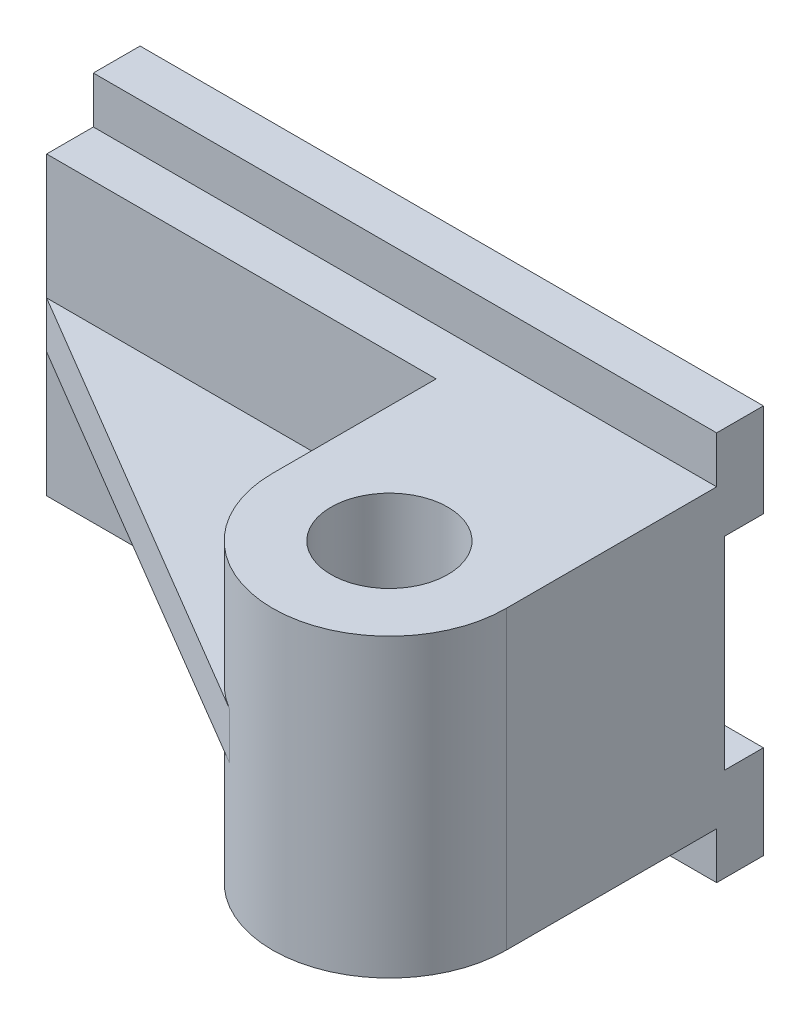
ISO-10303-21;
HEADER;
FILE_DESCRIPTION(('STEP AP214'),'2;1');
FILE_NAME('part.step','',(''),(''),'','','');
FILE_SCHEMA(('AUTOMOTIVE_DESIGN { 1 0 10303 214 1 1 1 1 }'));
ENDSEC;
DATA;
#1=APPLICATION_CONTEXT('core data for automotive mechanical design processes');
#2=APPLICATION_PROTOCOL_DEFINITION('international standard','automotive_design',2000,#1);
#3=PRODUCT_CONTEXT('',#1,'mechanical');
#4=PRODUCT('Part','Part','',(#3));
#5=PRODUCT_RELATED_PRODUCT_CATEGORY('part','',(#4));
#6=PRODUCT_DEFINITION_FORMATION('','',#4);
#7=PRODUCT_DEFINITION_CONTEXT('part definition',#1,'design');
#8=PRODUCT_DEFINITION('design','',#6,#7);
#9=PRODUCT_DEFINITION_SHAPE('','',#8);
#10=(LENGTH_UNIT() NAMED_UNIT(*) SI_UNIT(.MILLI.,.METRE.));
#11=(NAMED_UNIT(*) PLANE_ANGLE_UNIT() SI_UNIT($,.RADIAN.));
#12=(NAMED_UNIT(*) SI_UNIT($,.STERADIAN.) SOLID_ANGLE_UNIT());
#13=UNCERTAINTY_MEASURE_WITH_UNIT(LENGTH_MEASURE(1.E-05),#10,'distance_accuracy_value','');
#14=(GEOMETRIC_REPRESENTATION_CONTEXT(3) GLOBAL_UNCERTAINTY_ASSIGNED_CONTEXT((#13)) GLOBAL_UNIT_ASSIGNED_CONTEXT((#10,
#11,#12)) REPRESENTATION_CONTEXT('',''));
#15=CARTESIAN_POINT('',(0.,0.,0.));
#16=DIRECTION('',(0.,0.,1.));
#17=DIRECTION('',(1.,0.,0.));
#18=AXIS2_PLACEMENT_3D('',#15,#16,#17);
#19=CARTESIAN_POINT('',(0.,0.,12.));
#20=DIRECTION('',(0.,0.,1.));
#21=DIRECTION('',(1.,0.,0.));
#22=AXIS2_PLACEMENT_3D('',#19,#20,#21);
#23=PLANE('',#22);
#24=DIRECTION('',(0.,-1.,0.));
#25=VECTOR('',#24,1.);
#26=CARTESIAN_POINT('',(19.9999999999999,38.,12.));
#27=LINE('',#26,#25);
#28=CARTESIAN_POINT('',(19.9999999999999,-6.,12.));
#29=VERTEX_POINT('',#28);
#30=CARTESIAN_POINT('',(19.9999999999999,-38.,12.));
#31=VERTEX_POINT('',#30);
#32=EDGE_CURVE('E189',#29,#31,#27,.T.);
#33=ORIENTED_EDGE('',*,*,#32,.F.);
#34=DIRECTION('',(-1.,0.,0.));
#35=VECTOR('',#34,1.);
#36=CARTESIAN_POINT('',(0.,-6.,12.));
#37=LINE('',#36,#35);
#38=CARTESIAN_POINT('',(-80.0000000000001,-6.,12.));
#39=VERTEX_POINT('',#38);
#40=EDGE_CURVE('E181',#29,#39,#37,.T.);
#41=ORIENTED_EDGE('',*,*,#40,.T.);
#42=DIRECTION('',(0.,-1.,0.));
#43=VECTOR('',#42,1.);
#44=CARTESIAN_POINT('',(-80.0000000000001,38.,12.));
#45=LINE('',#44,#43);
#46=CARTESIAN_POINT('',(-80.0000000000001,-38.,12.));
#47=VERTEX_POINT('',#46);
#48=EDGE_CURVE('E187',#39,#47,#45,.T.);
#49=ORIENTED_EDGE('',*,*,#48,.T.);
#50=DIRECTION('',(1.,0.,0.));
#51=VECTOR('',#50,1.);
#52=CARTESIAN_POINT('',(-80.0000000000001,-38.,12.));
#53=LINE('',#52,#51);
#54=EDGE_CURVE('E201',#47,#31,#53,.T.);
#55=ORIENTED_EDGE('',*,*,#54,.T.);
#56=EDGE_LOOP('',(#33,#41,#49,#55));
#57=FACE_BOUND('',#56,.T.);
#58=ADVANCED_FACE('F39',(#57),#23,.T.);
#59=CARTESIAN_POINT('',(19.9999999999999,38.,0.));
#60=DIRECTION('',(1.,0.,0.));
#61=DIRECTION('',(0.,0.,-1.));
#62=AXIS2_PLACEMENT_3D('',#59,#60,#61);
#63=PLANE('',#62);
#64=DIRECTION('',(0.,0.,1.));
#65=VECTOR('',#64,1.);
#66=CARTESIAN_POINT('',(19.9999999999999,-6.,0.));
#67=LINE('',#66,#65);
#68=CARTESIAN_POINT('',(19.9999999999999,-6.,54.));
#69=VERTEX_POINT('',#68);
#70=EDGE_CURVE('E54',#29,#69,#67,.T.);
#71=ORIENTED_EDGE('',*,*,#70,.F.);
#72=ORIENTED_EDGE('',*,*,#32,.T.);
#73=DIRECTION('',(0.,0.,1.));
#74=VECTOR('',#73,1.);
#75=CARTESIAN_POINT('',(19.9999999999999,-38.,0.));
#76=LINE('',#75,#74);
#77=CARTESIAN_POINT('',(19.9999999999999,-38.,54.));
#78=VERTEX_POINT('',#77);
#79=EDGE_CURVE('E276',#31,#78,#76,.T.);
#80=ORIENTED_EDGE('',*,*,#79,.T.);
#81=DIRECTION('',(0.,-1.,0.));
#82=VECTOR('',#81,1.);
#83=CARTESIAN_POINT('',(19.9999999999999,38.,54.));
#84=LINE('',#83,#82);
#85=EDGE_CURVE('E293',#69,#78,#84,.T.);
#86=ORIENTED_EDGE('',*,*,#85,.F.);
#87=EDGE_LOOP('',(#71,#72,#80,#86));
#88=FACE_BOUND('',#87,.T.);
#89=ADVANCED_FACE('F369',(#88),#63,.F.);
#90=CARTESIAN_POINT('',(0.,0.,-12.));
#91=DIRECTION('',(0.,0.,-1.));
#92=DIRECTION('',(-1.,0.,0.));
#93=AXIS2_PLACEMENT_3D('',#90,#91,#92);
#94=PLANE('',#93);
#95=DIRECTION('',(0.,-1.,0.));
#96=VECTOR('',#95,1.);
#97=CARTESIAN_POINT('',(-80.0000000000001,-50.,-12.));
#98=LINE('',#97,#96);
#99=CARTESIAN_POINT('',(-80.0000000000001,-26.,-12.));
#100=VERTEX_POINT('',#99);
#101=CARTESIAN_POINT('',(-80.0000000000001,-50.,-12.));
#102=VERTEX_POINT('',#101);
#103=EDGE_CURVE('E232',#100,#102,#98,.T.);
#104=ORIENTED_EDGE('',*,*,#103,.F.);
#105=DIRECTION('',(1.,0.,0.));
#106=VECTOR('',#105,1.);
#107=CARTESIAN_POINT('',(-517.749868559375,-26.,-12.));
#108=LINE('',#107,#106);
#109=CARTESIAN_POINT('',(79.9999999999999,-26.,-12.));
#110=VERTEX_POINT('',#109);
#111=EDGE_CURVE('E295',#100,#110,#108,.T.);
#112=ORIENTED_EDGE('',*,*,#111,.T.);
#113=DIRECTION('',(0.,1.,0.));
#114=VECTOR('',#113,1.);
#115=CARTESIAN_POINT('',(79.9999999999999,-50.,-12.));
#116=LINE('',#115,#114);
#117=CARTESIAN_POINT('',(79.9999999999999,-50.,-12.));
#118=VERTEX_POINT('',#117);
#119=EDGE_CURVE('E225',#118,#110,#116,.T.);
#120=ORIENTED_EDGE('',*,*,#119,.F.);
#121=DIRECTION('',(1.,0.,0.));
#122=VECTOR('',#121,1.);
#123=CARTESIAN_POINT('',(-80.0000000000001,-50.,-12.));
#124=LINE('',#123,#122);
#125=EDGE_CURVE('E236',#102,#118,#124,.T.);
#126=ORIENTED_EDGE('',*,*,#125,.F.);
#127=EDGE_LOOP('',(#104,#112,#120,#126));
#128=FACE_BOUND('',#127,.T.);
#129=ADVANCED_FACE('F355',(#128),#94,.T.);
#130=CARTESIAN_POINT('',(0.,0.,0.));
#131=DIRECTION('',(0.,0.,-1.));
#132=DIRECTION('',(-1.,0.,0.));
#133=AXIS2_PLACEMENT_3D('',#130,#131,#132);
#134=PLANE('',#133);
#135=DIRECTION('',(-1.,0.,0.));
#136=VECTOR('',#135,1.);
#137=CARTESIAN_POINT('',(-80.0000000000001,38.,0.));
#138=LINE('',#137,#136);
#139=CARTESIAN_POINT('',(79.9999999999999,38.,0.));
#140=VERTEX_POINT('',#139);
#141=CARTESIAN_POINT('',(-80.0000000000001,38.,0.));
#142=VERTEX_POINT('',#141);
#143=EDGE_CURVE('E199',#140,#142,#138,.T.);
#144=ORIENTED_EDGE('',*,*,#143,.F.);
#145=DIRECTION('',(0.,1.,0.));
#146=VECTOR('',#145,1.);
#147=CARTESIAN_POINT('',(79.9999999999999,-50.,0.));
#148=LINE('',#147,#146);
#149=CARTESIAN_POINT('',(79.9999999999999,50.,0.));
#150=VERTEX_POINT('',#149);
#151=EDGE_CURVE('E224',#140,#150,#148,.T.);
#152=ORIENTED_EDGE('',*,*,#151,.T.);
#153=DIRECTION('',(-1.,0.,0.));
#154=VECTOR('',#153,1.);
#155=CARTESIAN_POINT('',(-80.0000000000001,50.,0.));
#156=LINE('',#155,#154);
#157=CARTESIAN_POINT('',(-80.0000000000001,50.,0.));
#158=VERTEX_POINT('',#157);
#159=EDGE_CURVE('E242',#150,#158,#156,.T.);
#160=ORIENTED_EDGE('',*,*,#159,.T.);
#161=DIRECTION('',(0.,-1.,0.));
#162=VECTOR('',#161,1.);
#163=CARTESIAN_POINT('',(-80.0000000000001,-50.,0.));
#164=LINE('',#163,#162);
#165=EDGE_CURVE('E246',#158,#142,#164,.T.);
#166=ORIENTED_EDGE('',*,*,#165,.T.);
#167=EDGE_LOOP('',(#144,#152,#160,#166));
#168=FACE_BOUND('',#167,.T.);
#169=ADVANCED_FACE('F476',(#168),#134,.F.);
#170=DIRECTION('',(1.,0.,0.));
#171=VECTOR('',#170,1.);
#172=CARTESIAN_POINT('',(-80.0000000000001,-38.,0.));
#173=LINE('',#172,#171);
#174=CARTESIAN_POINT('',(-80.0000000000001,-38.,0.));
#175=VERTEX_POINT('',#174);
#176=CARTESIAN_POINT('',(79.9999999999999,-38.,0.));
#177=VERTEX_POINT('',#176);
#178=EDGE_CURVE('E203',#175,#177,#173,.T.);
#179=ORIENTED_EDGE('',*,*,#178,.F.);
#180=CARTESIAN_POINT('',(-80.0000000000001,-50.,0.));
#181=VERTEX_POINT('',#180);
#182=EDGE_CURVE('E245',#175,#181,#164,.T.);
#183=ORIENTED_EDGE('',*,*,#182,.T.);
#184=DIRECTION('',(1.,0.,0.));
#185=VECTOR('',#184,1.);
#186=CARTESIAN_POINT('',(-80.0000000000001,-50.,0.));
#187=LINE('',#186,#185);
#188=CARTESIAN_POINT('',(79.9999999999999,-50.,0.));
#189=VERTEX_POINT('',#188);
#190=EDGE_CURVE('E248',#181,#189,#187,.T.);
#191=ORIENTED_EDGE('',*,*,#190,.T.);
#192=EDGE_CURVE('E240',#189,#177,#148,.T.);
#193=ORIENTED_EDGE('',*,*,#192,.T.);
#194=EDGE_LOOP('',(#179,#183,#191,#193));
#195=FACE_BOUND('',#194,.T.);
#196=ADVANCED_FACE('F346',(#195),#134,.F.);
#197=CARTESIAN_POINT('',(79.9999999999999,-50.,-12.));
#198=DIRECTION('',(1.,0.,0.));
#199=DIRECTION('',(0.,0.,-1.));
#200=AXIS2_PLACEMENT_3D('',#197,#198,#199);
#201=PLANE('',#200);
#202=DIRECTION('',(0.,-1.,0.));
#203=VECTOR('',#202,1.);
#204=CARTESIAN_POINT('',(79.9999999999999,38.,54.));
#205=LINE('',#204,#203);
#206=CARTESIAN_POINT('',(79.9999999999999,38.,54.));
#207=VERTEX_POINT('',#206);
#208=CARTESIAN_POINT('',(79.9999999999999,-38.,54.));
#209=VERTEX_POINT('',#208);
#210=EDGE_CURVE('E284',#207,#209,#205,.T.);
#211=ORIENTED_EDGE('',*,*,#210,.T.);
#212=DIRECTION('',(0.,0.,-1.));
#213=VECTOR('',#212,1.);
#214=CARTESIAN_POINT('',(79.9999999999999,-38.,12.));
#215=LINE('',#214,#213);
#216=EDGE_CURVE('E220',#209,#177,#215,.T.);
#217=ORIENTED_EDGE('',*,*,#216,.T.);
#218=ORIENTED_EDGE('',*,*,#192,.F.);
#219=DIRECTION('',(0.,0.,1.));
#220=VECTOR('',#219,1.);
#221=CARTESIAN_POINT('',(79.9999999999999,-50.,-12.));
#222=LINE('',#221,#220);
#223=EDGE_CURVE('E251',#118,#189,#222,.T.);
#224=ORIENTED_EDGE('',*,*,#223,.F.);
#225=ORIENTED_EDGE('',*,*,#119,.T.);
#226=DIRECTION('',(0.,0.,-1.));
#227=VECTOR('',#226,1.);
#228=CARTESIAN_POINT('',(79.9999999999999,-26.,-12.));
#229=LINE('',#228,#227);
#230=CARTESIAN_POINT('',(79.9999999999999,-26.,-2.));
#231=VERTEX_POINT('',#230);
#232=EDGE_CURVE('E305',#231,#110,#229,.T.);
#233=ORIENTED_EDGE('',*,*,#232,.F.);
#234=DIRECTION('',(0.,-1.,0.));
#235=VECTOR('',#234,1.);
#236=CARTESIAN_POINT('',(79.9999999999999,-50.,-2.));
#237=LINE('',#236,#235);
#238=CARTESIAN_POINT('',(79.9999999999999,26.,-2.00000000000001));
#239=VERTEX_POINT('',#238);
#240=EDGE_CURVE('E307',#239,#231,#237,.T.);
#241=ORIENTED_EDGE('',*,*,#240,.F.);
#242=DIRECTION('',(0.,0.,1.));
#243=VECTOR('',#242,1.);
#244=CARTESIAN_POINT('',(79.9999999999999,26.,-12.));
#245=LINE('',#244,#243);
#246=CARTESIAN_POINT('',(79.9999999999999,26.,-12.));
#247=VERTEX_POINT('',#246);
#248=EDGE_CURVE('E207',#247,#239,#245,.T.);
#249=ORIENTED_EDGE('',*,*,#248,.F.);
#250=CARTESIAN_POINT('',(79.9999999999999,50.,-12.));
#251=VERTEX_POINT('',#250);
#252=EDGE_CURVE('E229',#247,#251,#116,.T.);
#253=ORIENTED_EDGE('',*,*,#252,.T.);
#254=DIRECTION('',(0.,0.,1.));
#255=VECTOR('',#254,1.);
#256=CARTESIAN_POINT('',(79.9999999999999,50.,-12.));
#257=LINE('',#256,#255);
#258=EDGE_CURVE('E239',#251,#150,#257,.T.);
#259=ORIENTED_EDGE('',*,*,#258,.T.);
#260=ORIENTED_EDGE('',*,*,#151,.F.);
#261=DIRECTION('',(0.,0.,-1.));
#262=VECTOR('',#261,1.);
#263=CARTESIAN_POINT('',(79.9999999999999,38.,12.));
#264=LINE('',#263,#262);
#265=EDGE_CURVE('E217',#207,#140,#264,.T.);
#266=ORIENTED_EDGE('',*,*,#265,.F.);
#267=EDGE_LOOP('',(#211,#217,#218,#224,#225,#233,#241,#249,#253,#259,#260,#266));
#268=FACE_BOUND('',#267,.T.);
#269=ADVANCED_FACE('F41',(#268),#201,.T.);
#270=CARTESIAN_POINT('',(-80.0000000000001,-50.,-12.));
#271=DIRECTION('',(0.,-1.,0.));
#272=DIRECTION('',(0.,0.,-1.));
#273=AXIS2_PLACEMENT_3D('',#270,#271,#272);
#274=PLANE('',#273);
#275=ORIENTED_EDGE('',*,*,#190,.F.);
#276=DIRECTION('',(0.,0.,1.));
#277=VECTOR('',#276,1.);
#278=CARTESIAN_POINT('',(-80.0000000000001,-50.,-12.));
#279=LINE('',#278,#277);
#280=EDGE_CURVE('E254',#102,#181,#279,.T.);
#281=ORIENTED_EDGE('',*,*,#280,.F.);
#282=ORIENTED_EDGE('',*,*,#125,.T.);
#283=ORIENTED_EDGE('',*,*,#223,.T.);
#284=EDGE_LOOP('',(#275,#281,#282,#283));
#285=FACE_BOUND('',#284,.T.);
#286=ADVANCED_FACE('F352',(#285),#274,.T.);
#287=CARTESIAN_POINT('',(-80.0000000000001,-50.,-12.));
#288=DIRECTION('',(-1.,0.,0.));
#289=DIRECTION('',(0.,0.,1.));
#290=AXIS2_PLACEMENT_3D('',#287,#288,#289);
#291=PLANE('',#290);
#292=DIRECTION('',(0.,0.,-1.));
#293=VECTOR('',#292,1.);
#294=CARTESIAN_POINT('',(-80.0000000000001,26.,-12.));
#295=LINE('',#294,#293);
#296=CARTESIAN_POINT('',(-80.0000000000001,26.,-2.00000000000001));
#297=VERTEX_POINT('',#296);
#298=CARTESIAN_POINT('',(-80.0000000000001,26.,-12.));
#299=VERTEX_POINT('',#298);
#300=EDGE_CURVE('E47',#297,#299,#295,.T.);
#301=ORIENTED_EDGE('',*,*,#300,.F.);
#302=DIRECTION('',(0.,1.,0.));
#303=VECTOR('',#302,1.);
#304=CARTESIAN_POINT('',(-80.0000000000001,-50.,-2.));
#305=LINE('',#304,#303);
#306=CARTESIAN_POINT('',(-80.0000000000001,-26.,-2.));
#307=VERTEX_POINT('',#306);
#308=EDGE_CURVE('E263',#307,#297,#305,.T.);
#309=ORIENTED_EDGE('',*,*,#308,.F.);
#310=DIRECTION('',(0.,0.,1.));
#311=VECTOR('',#310,1.);
#312=CARTESIAN_POINT('',(-80.0000000000001,-26.,-12.));
#313=LINE('',#312,#311);
#314=EDGE_CURVE('E253',#100,#307,#313,.T.);
#315=ORIENTED_EDGE('',*,*,#314,.F.);
#316=ORIENTED_EDGE('',*,*,#103,.T.);
#317=ORIENTED_EDGE('',*,*,#280,.T.);
#318=ORIENTED_EDGE('',*,*,#182,.F.);
#319=DIRECTION('',(0.,0.,-1.));
#320=VECTOR('',#319,1.);
#321=CARTESIAN_POINT('',(-80.0000000000001,-38.,12.));
#322=LINE('',#321,#320);
#323=EDGE_CURVE('E197',#47,#175,#322,.T.);
#324=ORIENTED_EDGE('',*,*,#323,.F.);
#325=ORIENTED_EDGE('',*,*,#48,.F.);
#326=DIRECTION('',(0.,-1.,0.));
#327=VECTOR('',#326,1.);
#328=CARTESIAN_POINT('',(-80.0000000000001,0.,12.));
#329=LINE('',#328,#327);
#330=CARTESIAN_POINT('',(-80.0000000000001,6.,12.));
#331=VERTEX_POINT('',#330);
#332=EDGE_CURVE('E165',#331,#39,#329,.T.);
#333=ORIENTED_EDGE('',*,*,#332,.F.);
#334=CARTESIAN_POINT('',(-80.0000000000001,38.,12.));
#335=VERTEX_POINT('',#334);
#336=EDGE_CURVE('E198',#335,#331,#45,.T.);
#337=ORIENTED_EDGE('',*,*,#336,.F.);
#338=DIRECTION('',(0.,0.,-1.));
#339=VECTOR('',#338,1.);
#340=CARTESIAN_POINT('',(-80.0000000000001,38.,12.));
#341=LINE('',#340,#339);
#342=EDGE_CURVE('E212',#335,#142,#341,.T.);
#343=ORIENTED_EDGE('',*,*,#342,.T.);
#344=ORIENTED_EDGE('',*,*,#165,.F.);
#345=DIRECTION('',(0.,0.,1.));
#346=VECTOR('',#345,1.);
#347=CARTESIAN_POINT('',(-80.0000000000001,50.,-12.));
#348=LINE('',#347,#346);
#349=CARTESIAN_POINT('',(-80.0000000000001,50.,-12.));
#350=VERTEX_POINT('',#349);
#351=EDGE_CURVE('E257',#350,#158,#348,.T.);
#352=ORIENTED_EDGE('',*,*,#351,.F.);
#353=EDGE_CURVE('E233',#350,#299,#98,.T.);
#354=ORIENTED_EDGE('',*,*,#353,.T.);
#355=EDGE_LOOP('',(#301,#309,#315,#316,#317,#318,#324,#325,#333,#337,#343,#344,#352,#354));
#356=FACE_BOUND('',#355,.T.);
#357=ADVANCED_FACE('F194',(#356),#291,.T.);
#358=CARTESIAN_POINT('',(-80.0000000000001,50.,-12.));
#359=DIRECTION('',(0.,1.,0.));
#360=DIRECTION('',(0.,0.,1.));
#361=AXIS2_PLACEMENT_3D('',#358,#359,#360);
#362=PLANE('',#361);
#363=ORIENTED_EDGE('',*,*,#159,.F.);
#364=ORIENTED_EDGE('',*,*,#258,.F.);
#365=DIRECTION('',(-1.,0.,0.));
#366=VECTOR('',#365,1.);
#367=CARTESIAN_POINT('',(-80.0000000000001,50.,-12.));
#368=LINE('',#367,#366);
#369=EDGE_CURVE('E228',#251,#350,#368,.T.);
#370=ORIENTED_EDGE('',*,*,#369,.T.);
#371=ORIENTED_EDGE('',*,*,#351,.T.);
#372=EDGE_LOOP('',(#363,#364,#370,#371));
#373=FACE_BOUND('',#372,.T.);
#374=ADVANCED_FACE('F326',(#373),#362,.T.);
#375=DIRECTION('',(1.,0.,0.));
#376=VECTOR('',#375,1.);
#377=CARTESIAN_POINT('',(-517.749868559375,26.,-12.));
#378=LINE('',#377,#376);
#379=EDGE_CURVE('E302',#299,#247,#378,.T.);
#380=ORIENTED_EDGE('',*,*,#379,.F.);
#381=ORIENTED_EDGE('',*,*,#353,.F.);
#382=ORIENTED_EDGE('',*,*,#369,.F.);
#383=ORIENTED_EDGE('',*,*,#252,.F.);
#384=EDGE_LOOP('',(#380,#381,#382,#383));
#385=FACE_BOUND('',#384,.T.);
#386=ADVANCED_FACE('F322',(#385),#94,.T.);
#387=CARTESIAN_POINT('',(-80.0000000000001,-38.,12.));
#388=DIRECTION('',(0.,1.,0.));
#389=DIRECTION('',(0.,0.,1.));
#390=AXIS2_PLACEMENT_3D('',#387,#388,#389);
#391=PLANE('',#390);
#392=CARTESIAN_POINT('',(50.,-38.,54.));
#393=DIRECTION('',(0.,1.,0.));
#394=DIRECTION('',(0.,0.,1.));
#395=AXIS2_PLACEMENT_3D('',#392,#393,#394);
#396=CIRCLE('',#395,15.);
#397=CARTESIAN_POINT('',(50.,-38.,69.));
#398=VERTEX_POINT('',#397);
#399=EDGE_CURVE('E267',#398,#398,#396,.T.);
#400=ORIENTED_EDGE('',*,*,#399,.T.);
#401=EDGE_LOOP('',(#400));
#402=FACE_BOUND('',#401,.T.);
#403=ORIENTED_EDGE('',*,*,#178,.T.);
#404=ORIENTED_EDGE('',*,*,#216,.F.);
#405=CARTESIAN_POINT('',(50.,-38.,54.));
#406=DIRECTION('',(0.,-1.,0.));
#407=DIRECTION('',(0.,0.,-1.));
#408=AXIS2_PLACEMENT_3D('',#405,#406,#407);
#409=CIRCLE('',#408,30.);
#410=EDGE_CURVE('E271',#209,#78,#409,.T.);
#411=ORIENTED_EDGE('',*,*,#410,.T.);
#412=ORIENTED_EDGE('',*,*,#79,.F.);
#413=ORIENTED_EDGE('',*,*,#54,.F.);
#414=ORIENTED_EDGE('',*,*,#323,.T.);
#415=EDGE_LOOP('',(#403,#404,#411,#412,#413,#414));
#416=FACE_BOUND('',#415,.T.);
#417=ADVANCED_FACE('F343',(#402,#416),#391,.F.);
#418=CARTESIAN_POINT('',(-80.0000000000001,38.,12.));
#419=DIRECTION('',(0.,-1.,0.));
#420=DIRECTION('',(0.,0.,-1.));
#421=AXIS2_PLACEMENT_3D('',#418,#419,#420);
#422=PLANE('',#421);
#423=CARTESIAN_POINT('',(50.,38.,54.));
#424=DIRECTION('',(0.,-1.,0.));
#425=DIRECTION('',(0.,0.,-1.));
#426=AXIS2_PLACEMENT_3D('',#423,#424,#425);
#427=CIRCLE('',#426,15.);
#428=CARTESIAN_POINT('',(50.,38.,39.));
#429=VERTEX_POINT('',#428);
#430=EDGE_CURVE('E176',#429,#429,#427,.T.);
#431=ORIENTED_EDGE('',*,*,#430,.T.);
#432=EDGE_LOOP('',(#431));
#433=FACE_BOUND('',#432,.T.);
#434=ORIENTED_EDGE('',*,*,#143,.T.);
#435=ORIENTED_EDGE('',*,*,#342,.F.);
#436=DIRECTION('',(-1.,0.,0.));
#437=VECTOR('',#436,1.);
#438=CARTESIAN_POINT('',(-80.0000000000001,38.,12.));
#439=LINE('',#438,#437);
#440=CARTESIAN_POINT('',(19.9999999999999,38.,12.));
#441=VERTEX_POINT('',#440);
#442=EDGE_CURVE('E210',#441,#335,#439,.T.);
#443=ORIENTED_EDGE('',*,*,#442,.F.);
#444=DIRECTION('',(0.,0.,1.));
#445=VECTOR('',#444,1.);
#446=CARTESIAN_POINT('',(19.9999999999999,38.,0.));
#447=LINE('',#446,#445);
#448=CARTESIAN_POINT('',(19.9999999999999,38.,54.));
#449=VERTEX_POINT('',#448);
#450=EDGE_CURVE('E283',#441,#449,#447,.T.);
#451=ORIENTED_EDGE('',*,*,#450,.T.);
#452=CARTESIAN_POINT('',(50.,38.,54.));
#453=DIRECTION('',(0.,-1.,0.));
#454=DIRECTION('',(0.,0.,-1.));
#455=AXIS2_PLACEMENT_3D('',#452,#453,#454);
#456=CIRCLE('',#455,30.);
#457=EDGE_CURVE('E280',#207,#449,#456,.T.);
#458=ORIENTED_EDGE('',*,*,#457,.F.);
#459=ORIENTED_EDGE('',*,*,#265,.T.);
#460=EDGE_LOOP('',(#434,#435,#443,#451,#458,#459));
#461=FACE_BOUND('',#460,.T.);
#462=ADVANCED_FACE('F332',(#433,#461),#422,.F.);
#463=DIRECTION('',(-1.,0.,0.));
#464=VECTOR('',#463,1.);
#465=CARTESIAN_POINT('',(0.,6.,12.));
#466=LINE('',#465,#464);
#467=CARTESIAN_POINT('',(19.9999999999999,6.,12.));
#468=VERTEX_POINT('',#467);
#469=EDGE_CURVE('E177',#468,#331,#466,.T.);
#470=ORIENTED_EDGE('',*,*,#469,.F.);
#471=EDGE_CURVE('E62',#441,#468,#27,.T.);
#472=ORIENTED_EDGE('',*,*,#471,.F.);
#473=ORIENTED_EDGE('',*,*,#442,.T.);
#474=ORIENTED_EDGE('',*,*,#336,.T.);
#475=EDGE_LOOP('',(#470,#472,#473,#474));
#476=FACE_BOUND('',#475,.T.);
#477=ADVANCED_FACE('F375',(#476),#23,.T.);
#478=CARTESIAN_POINT('',(-517.749868559375,26.,-12.));
#479=DIRECTION('',(0.,1.,0.));
#480=DIRECTION('',(0.,0.,1.));
#481=AXIS2_PLACEMENT_3D('',#478,#479,#480);
#482=PLANE('',#481);
#483=ORIENTED_EDGE('',*,*,#379,.T.);
#484=ORIENTED_EDGE('',*,*,#248,.T.);
#485=DIRECTION('',(1.,0.,0.));
#486=VECTOR('',#485,1.);
#487=CARTESIAN_POINT('',(-517.749868559375,26.,-2.00000000000001));
#488=LINE('',#487,#486);
#489=EDGE_CURVE('E297',#297,#239,#488,.T.);
#490=ORIENTED_EDGE('',*,*,#489,.F.);
#491=ORIENTED_EDGE('',*,*,#300,.T.);
#492=EDGE_LOOP('',(#483,#484,#490,#491));
#493=FACE_BOUND('',#492,.T.);
#494=ADVANCED_FACE('F314',(#493),#482,.F.);
#495=CARTESIAN_POINT('',(-517.749868559375,26.,-2.00000000000001));
#496=DIRECTION('',(0.,0.,1.));
#497=DIRECTION('',(0.,-1.,0.));
#498=AXIS2_PLACEMENT_3D('',#495,#496,#497);
#499=PLANE('',#498);
#500=ORIENTED_EDGE('',*,*,#240,.T.);
#501=DIRECTION('',(1.,0.,0.));
#502=VECTOR('',#501,1.);
#503=CARTESIAN_POINT('',(-517.749868559375,-26.,-2.));
#504=LINE('',#503,#502);
#505=EDGE_CURVE('E289',#307,#231,#504,.T.);
#506=ORIENTED_EDGE('',*,*,#505,.F.);
#507=ORIENTED_EDGE('',*,*,#308,.T.);
#508=ORIENTED_EDGE('',*,*,#489,.T.);
#509=EDGE_LOOP('',(#500,#506,#507,#508));
#510=FACE_BOUND('',#509,.T.);
#511=ADVANCED_FACE('F317',(#510),#499,.F.);
#512=CARTESIAN_POINT('',(-517.749868559375,-26.,-2.));
#513=DIRECTION('',(0.,-1.,0.));
#514=DIRECTION('',(0.,0.,-1.));
#515=AXIS2_PLACEMENT_3D('',#512,#513,#514);
#516=PLANE('',#515);
#517=ORIENTED_EDGE('',*,*,#505,.T.);
#518=ORIENTED_EDGE('',*,*,#232,.T.);
#519=ORIENTED_EDGE('',*,*,#111,.F.);
#520=ORIENTED_EDGE('',*,*,#314,.T.);
#521=EDGE_LOOP('',(#517,#518,#519,#520));
#522=FACE_BOUND('',#521,.T.);
#523=ADVANCED_FACE('F358',(#522),#516,.F.);
#524=ORIENTED_EDGE('',*,*,#471,.T.);
#525=DIRECTION('',(0.,0.,1.));
#526=VECTOR('',#525,1.);
#527=CARTESIAN_POINT('',(19.9999999999999,6.,0.));
#528=LINE('',#527,#526);
#529=CARTESIAN_POINT('',(20.,6.,54.));
#530=VERTEX_POINT('',#529);
#531=EDGE_CURVE('E388',#468,#530,#528,.T.);
#532=ORIENTED_EDGE('',*,*,#531,.T.);
#533=EDGE_CURVE('E290',#449,#530,#84,.T.);
#534=ORIENTED_EDGE('',*,*,#533,.F.);
#535=ORIENTED_EDGE('',*,*,#450,.F.);
#536=EDGE_LOOP('',(#524,#532,#534,#535));
#537=FACE_BOUND('',#536,.T.);
#538=ADVANCED_FACE('F360',(#537),#63,.F.);
#539=CARTESIAN_POINT('',(50.,38.,54.));
#540=DIRECTION('',(0.,-1.,0.));
#541=DIRECTION('',(0.,0.,-1.));
#542=AXIS2_PLACEMENT_3D('',#539,#540,#541);
#543=CYLINDRICAL_SURFACE('',#542,30.);
#544=CARTESIAN_POINT('',(50.,6.,54.));
#545=DIRECTION('',(0.,1.,0.));
#546=DIRECTION('',(0.,0.,1.));
#547=AXIS2_PLACEMENT_3D('',#544,#545,#546);
#548=CIRCLE('',#547,30.);
#549=CARTESIAN_POINT('',(34.7334500974075,6.,79.8250354127861));
#550=VERTEX_POINT('',#549);
#551=EDGE_CURVE('E190',#550,#530,#548,.F.);
#552=ORIENTED_EDGE('',*,*,#551,.F.);
#553=DIRECTION('',(0.,-1.,0.));
#554=VECTOR('',#553,1.);
#555=CARTESIAN_POINT('',(34.7334500974075,38.,79.8250354127861));
#556=LINE('',#555,#554);
#557=CARTESIAN_POINT('',(34.7334500974075,-6.,79.8250354127861));
#558=VERTEX_POINT('',#557);
#559=EDGE_CURVE('E11',#558,#550,#556,.F.);
#560=ORIENTED_EDGE('',*,*,#559,.F.);
#561=CARTESIAN_POINT('',(50.,-6.,54.));
#562=DIRECTION('',(0.,1.,0.));
#563=DIRECTION('',(0.,0.,1.));
#564=AXIS2_PLACEMENT_3D('',#561,#562,#563);
#565=CIRCLE('',#564,30.);
#566=EDGE_CURVE('E182',#558,#69,#565,.F.);
#567=ORIENTED_EDGE('',*,*,#566,.T.);
#568=ORIENTED_EDGE('',*,*,#85,.T.);
#569=ORIENTED_EDGE('',*,*,#410,.F.);
#570=ORIENTED_EDGE('',*,*,#210,.F.);
#571=ORIENTED_EDGE('',*,*,#457,.T.);
#572=ORIENTED_EDGE('',*,*,#533,.T.);
#573=EDGE_LOOP('',(#552,#560,#567,#568,#569,#570,#571,#572));
#574=FACE_BOUND('',#573,.T.);
#575=ADVANCED_FACE('F338',(#574),#543,.T.);
#576=CARTESIAN_POINT('',(50.,50.,54.));
#577=DIRECTION('',(0.,-1.,0.));
#578=DIRECTION('',(0.,0.,-1.));
#579=AXIS2_PLACEMENT_3D('',#576,#577,#578);
#580=CYLINDRICAL_SURFACE('',#579,15.);
#581=ORIENTED_EDGE('',*,*,#430,.F.);
#582=EDGE_LOOP('',(#581));
#583=FACE_BOUND('',#582,.T.);
#584=ORIENTED_EDGE('',*,*,#399,.F.);
#585=EDGE_LOOP('',(#584));
#586=FACE_BOUND('',#585,.T.);
#587=ADVANCED_FACE('F404',(#583,#586),#580,.F.);
#588=CARTESIAN_POINT('',(-80.0000000000001,0.,12.));
#589=DIRECTION('',(-0.508884996753081,0.,0.860834513759536));
#590=DIRECTION('',(0.860834513759536,0.,0.508884996753081));
#591=AXIS2_PLACEMENT_3D('',#588,#589,#590);
#592=PLANE('',#591);
#593=DIRECTION('',(0.860834513759536,0.,0.508884996753081));
#594=VECTOR('',#593,1.);
#595=CARTESIAN_POINT('',(-80.0000000000001,6.,12.));
#596=LINE('',#595,#594);
#597=EDGE_CURVE('E171',#331,#550,#596,.T.);
#598=ORIENTED_EDGE('',*,*,#597,.F.);
#599=ORIENTED_EDGE('',*,*,#332,.T.);
#600=DIRECTION('',(0.860834513759536,0.,0.508884996753081));
#601=VECTOR('',#600,1.);
#602=CARTESIAN_POINT('',(-80.0000000000001,-6.,12.));
#603=LINE('',#602,#601);
#604=EDGE_CURVE('E168',#39,#558,#603,.T.);
#605=ORIENTED_EDGE('',*,*,#604,.T.);
#606=ORIENTED_EDGE('',*,*,#559,.T.);
#607=EDGE_LOOP('',(#598,#599,#605,#606));
#608=FACE_BOUND('',#607,.T.);
#609=ADVANCED_FACE('F167',(#608),#592,.T.);
#610=CARTESIAN_POINT('',(0.,6.,36.));
#611=DIRECTION('',(0.,1.,0.));
#612=DIRECTION('',(0.,0.,1.));
#613=AXIS2_PLACEMENT_3D('',#610,#611,#612);
#614=PLANE('',#613);
#615=ORIENTED_EDGE('',*,*,#531,.F.);
#616=ORIENTED_EDGE('',*,*,#469,.T.);
#617=ORIENTED_EDGE('',*,*,#597,.T.);
#618=ORIENTED_EDGE('',*,*,#551,.T.);
#619=EDGE_LOOP('',(#615,#616,#617,#618));
#620=FACE_BOUND('',#619,.T.);
#621=ADVANCED_FACE('F395',(#620),#614,.T.);
#622=CARTESIAN_POINT('',(0.,-6.,36.));
#623=DIRECTION('',(0.,1.,0.));
#624=DIRECTION('',(0.,0.,1.));
#625=AXIS2_PLACEMENT_3D('',#622,#623,#624);
#626=PLANE('',#625);
#627=ORIENTED_EDGE('',*,*,#40,.F.);
#628=ORIENTED_EDGE('',*,*,#70,.T.);
#629=ORIENTED_EDGE('',*,*,#566,.F.);
#630=ORIENTED_EDGE('',*,*,#604,.F.);
#631=EDGE_LOOP('',(#627,#628,#629,#630));
#632=FACE_BOUND('',#631,.T.);
#633=ADVANCED_FACE('F180',(#632),#626,.F.);
#634=CLOSED_SHELL('',(#58,#89,#129,#169,#196,#269,#286,#357,#374,#386,#417,#462,#477,#494,#511,
#523,#538,#575,#587,#609,#621,#633));
#635=MANIFOLD_SOLID_BREP('B2',#634);
#636=ADVANCED_BREP_SHAPE_REPRESENTATION('',(#18,#635),#14);
#637=SHAPE_DEFINITION_REPRESENTATION(#9,#636);
ENDSEC;
END-ISO-10303-21;
